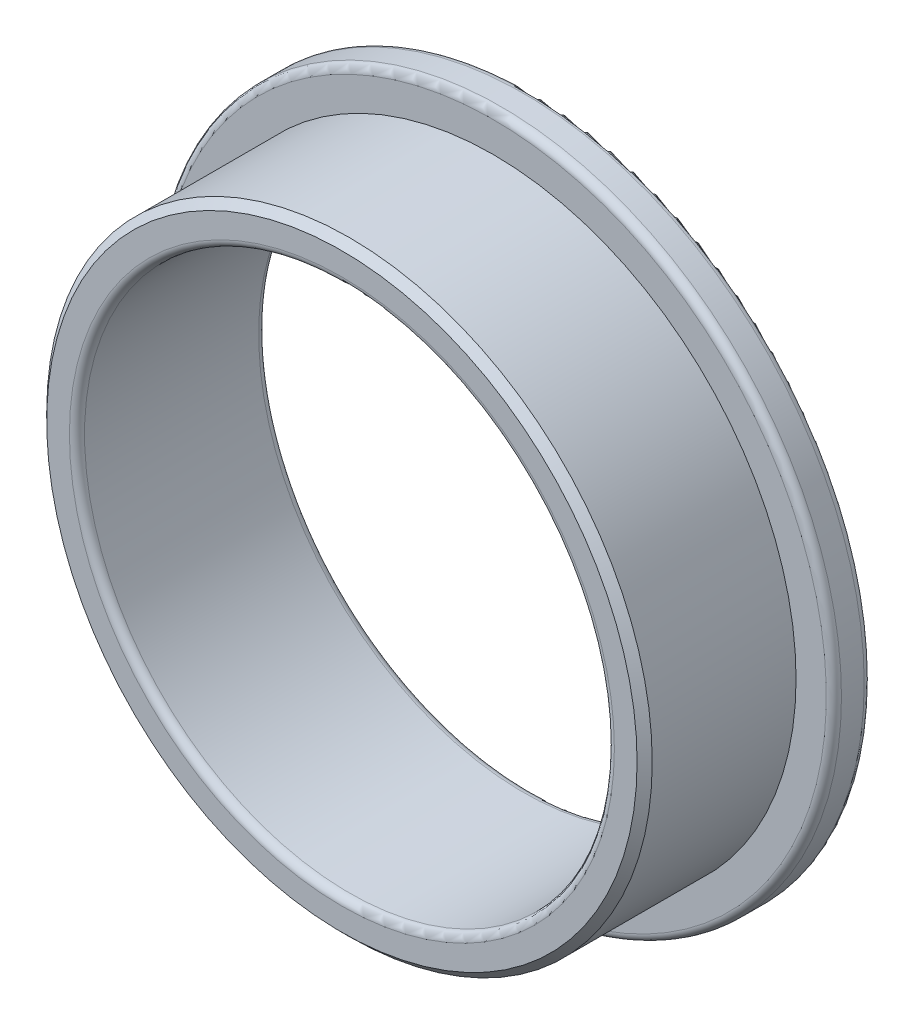
ISO-10303-21;
HEADER;
FILE_DESCRIPTION(('STEP AP214'),'2;1');
FILE_NAME('part.step','',(''),(''),'','','');
FILE_SCHEMA(('AUTOMOTIVE_DESIGN { 1 0 10303 214 1 1 1 1 }'));
ENDSEC;
DATA;
#1=APPLICATION_CONTEXT('core data for automotive mechanical design processes');
#2=APPLICATION_PROTOCOL_DEFINITION('international standard','automotive_design',2000,#1);
#3=PRODUCT_CONTEXT('',#1,'mechanical');
#4=PRODUCT('Part','Part','',(#3));
#5=PRODUCT_RELATED_PRODUCT_CATEGORY('part','',(#4));
#6=PRODUCT_DEFINITION_FORMATION('','',#4);
#7=PRODUCT_DEFINITION_CONTEXT('part definition',#1,'design');
#8=PRODUCT_DEFINITION('design','',#6,#7);
#9=PRODUCT_DEFINITION_SHAPE('','',#8);
#10=(LENGTH_UNIT() NAMED_UNIT(*) SI_UNIT(.MILLI.,.METRE.));
#11=(NAMED_UNIT(*) PLANE_ANGLE_UNIT() SI_UNIT($,.RADIAN.));
#12=(NAMED_UNIT(*) SI_UNIT($,.STERADIAN.) SOLID_ANGLE_UNIT());
#13=UNCERTAINTY_MEASURE_WITH_UNIT(LENGTH_MEASURE(1.E-05),#10,'distance_accuracy_value','');
#14=(GEOMETRIC_REPRESENTATION_CONTEXT(3) GLOBAL_UNCERTAINTY_ASSIGNED_CONTEXT((#13)) GLOBAL_UNIT_ASSIGNED_CONTEXT((#10,
#11,#12)) REPRESENTATION_CONTEXT('',''));
#15=CARTESIAN_POINT('',(0.,0.,0.));
#16=DIRECTION('',(0.,0.,1.));
#17=DIRECTION('',(1.,0.,0.));
#18=AXIS2_PLACEMENT_3D('',#15,#16,#17);
#19=CARTESIAN_POINT('',(0.,0.,5.));
#20=DIRECTION('',(0.,0.,-1.));
#21=DIRECTION('',(-1.,0.,0.));
#22=AXIS2_PLACEMENT_3D('',#19,#20,#21);
#23=CYLINDRICAL_SURFACE('',#22,8.);
#24=CARTESIAN_POINT('',(0.,0.,4.8));
#25=DIRECTION('',(0.,0.,1.));
#26=DIRECTION('',(1.,0.,0.));
#27=AXIS2_PLACEMENT_3D('',#24,#25,#26);
#28=CIRCLE('',#27,8.);
#29=CARTESIAN_POINT('',(8.,0.,4.8));
#30=VERTEX_POINT('',#29);
#31=EDGE_CURVE('E10',#30,#30,#28,.F.);
#32=ORIENTED_EDGE('',*,*,#31,.T.);
#33=EDGE_LOOP('',(#32));
#34=FACE_BOUND('',#33,.T.);
#35=CARTESIAN_POINT('',(0.,0.,1.));
#36=DIRECTION('',(0.,0.,-1.));
#37=DIRECTION('',(-1.,0.,0.));
#38=AXIS2_PLACEMENT_3D('',#35,#36,#37);
#39=CIRCLE('',#38,8.);
#40=CARTESIAN_POINT('',(-8.,0.,1.));
#41=VERTEX_POINT('',#40);
#42=EDGE_CURVE('E21',#41,#41,#39,.T.);
#43=ORIENTED_EDGE('',*,*,#42,.F.);
#44=EDGE_LOOP('',(#43));
#45=FACE_BOUND('',#44,.T.);
#46=ADVANCED_FACE('F15',(#34,#45),#23,.T.);
#47=CARTESIAN_POINT('',(0.,0.,5.));
#48=DIRECTION('',(0.,0.,1.));
#49=DIRECTION('',(1.,0.,0.));
#50=AXIS2_PLACEMENT_3D('',#47,#48,#49);
#51=PLANE('',#50);
#52=CARTESIAN_POINT('',(0.,0.,5.));
#53=DIRECTION('',(0.,0.,1.));
#54=DIRECTION('',(1.,0.,0.));
#55=AXIS2_PLACEMENT_3D('',#52,#53,#54);
#56=CIRCLE('',#55,7.8);
#57=CARTESIAN_POINT('',(7.8,0.,5.));
#58=VERTEX_POINT('',#57);
#59=EDGE_CURVE('E25',#58,#58,#56,.T.);
#60=ORIENTED_EDGE('',*,*,#59,.T.);
#61=EDGE_LOOP('',(#60));
#62=FACE_BOUND('',#61,.T.);
#63=CARTESIAN_POINT('',(0.,0.,5.));
#64=DIRECTION('',(0.,0.,1.));
#65=DIRECTION('',(1.,0.,0.));
#66=AXIS2_PLACEMENT_3D('',#63,#64,#65);
#67=CIRCLE('',#66,7.2);
#68=CARTESIAN_POINT('',(7.2,0.,5.));
#69=VERTEX_POINT('',#68);
#70=EDGE_CURVE('E29',#69,#69,#67,.F.);
#71=ORIENTED_EDGE('',*,*,#70,.T.);
#72=EDGE_LOOP('',(#71));
#73=FACE_BOUND('',#72,.T.);
#74=ADVANCED_FACE('F76',(#62,#73),#51,.T.);
#75=CARTESIAN_POINT('',(0.,0.,0.));
#76=DIRECTION('',(0.,0.,1.));
#77=DIRECTION('',(1.,0.,0.));
#78=AXIS2_PLACEMENT_3D('',#75,#76,#77);
#79=PLANE('',#78);
#80=CARTESIAN_POINT('',(0.,0.,0.));
#81=DIRECTION('',(0.,0.,1.));
#82=DIRECTION('',(1.,0.,0.));
#83=AXIS2_PLACEMENT_3D('',#80,#81,#82);
#84=CIRCLE('',#83,7.2);
#85=CARTESIAN_POINT('',(7.2,0.,0.));
#86=VERTEX_POINT('',#85);
#87=EDGE_CURVE('E34',#86,#86,#84,.T.);
#88=ORIENTED_EDGE('',*,*,#87,.T.);
#89=EDGE_LOOP('',(#88));
#90=FACE_BOUND('',#89,.T.);
#91=CARTESIAN_POINT('',(0.,0.,0.));
#92=DIRECTION('',(0.,0.,1.));
#93=DIRECTION('',(1.,0.,0.));
#94=AXIS2_PLACEMENT_3D('',#91,#92,#93);
#95=CIRCLE('',#94,8.8);
#96=CARTESIAN_POINT('',(8.8,0.,0.));
#97=VERTEX_POINT('',#96);
#98=EDGE_CURVE('E37',#97,#97,#95,.F.);
#99=ORIENTED_EDGE('',*,*,#98,.T.);
#100=EDGE_LOOP('',(#99));
#101=FACE_BOUND('',#100,.T.);
#102=ADVANCED_FACE('F80',(#90,#101),#79,.F.);
#103=CARTESIAN_POINT('',(0.,0.,5.));
#104=DIRECTION('',(0.,0.,-1.));
#105=DIRECTION('',(-1.,0.,0.));
#106=AXIS2_PLACEMENT_3D('',#103,#104,#105);
#107=CYLINDRICAL_SURFACE('',#106,7.);
#108=CARTESIAN_POINT('',(0.,0.,0.2));
#109=DIRECTION('',(0.,0.,1.));
#110=DIRECTION('',(1.,0.,0.));
#111=AXIS2_PLACEMENT_3D('',#108,#109,#110);
#112=CIRCLE('',#111,7.);
#113=CARTESIAN_POINT('',(7.,0.,0.2));
#114=VERTEX_POINT('',#113);
#115=EDGE_CURVE('E40',#114,#114,#112,.F.);
#116=ORIENTED_EDGE('',*,*,#115,.T.);
#117=EDGE_LOOP('',(#116));
#118=FACE_BOUND('',#117,.T.);
#119=CARTESIAN_POINT('',(0.,0.,4.8));
#120=DIRECTION('',(0.,0.,1.));
#121=DIRECTION('',(1.,0.,0.));
#122=AXIS2_PLACEMENT_3D('',#119,#120,#121);
#123=CIRCLE('',#122,7.);
#124=CARTESIAN_POINT('',(7.,0.,4.8));
#125=VERTEX_POINT('',#124);
#126=EDGE_CURVE('E43',#125,#125,#123,.T.);
#127=ORIENTED_EDGE('',*,*,#126,.T.);
#128=EDGE_LOOP('',(#127));
#129=FACE_BOUND('',#128,.T.);
#130=ADVANCED_FACE('F86',(#118,#129),#107,.F.);
#131=CARTESIAN_POINT('',(0.,0.,1.));
#132=DIRECTION('',(0.,0.,-1.));
#133=DIRECTION('',(-1.,0.,0.));
#134=AXIS2_PLACEMENT_3D('',#131,#132,#133);
#135=PLANE('',#134);
#136=CARTESIAN_POINT('',(0.,0.,1.));
#137=DIRECTION('',(0.,0.,-1.));
#138=DIRECTION('',(-1.,0.,0.));
#139=AXIS2_PLACEMENT_3D('',#136,#137,#138);
#140=CIRCLE('',#139,8.8);
#141=CARTESIAN_POINT('',(-8.8,0.,1.));
#142=VERTEX_POINT('',#141);
#143=EDGE_CURVE('E46',#142,#142,#140,.F.);
#144=ORIENTED_EDGE('',*,*,#143,.T.);
#145=EDGE_LOOP('',(#144));
#146=FACE_BOUND('',#145,.T.);
#147=ORIENTED_EDGE('',*,*,#42,.T.);
#148=EDGE_LOOP('',(#147));
#149=FACE_BOUND('',#148,.T.);
#150=ADVANCED_FACE('F93',(#146,#149),#135,.F.);
#151=CARTESIAN_POINT('',(0.,0.,1.));
#152=DIRECTION('',(0.,0.,-1.));
#153=DIRECTION('',(-1.,0.,0.));
#154=AXIS2_PLACEMENT_3D('',#151,#152,#153);
#155=CYLINDRICAL_SURFACE('',#154,9.);
#156=CARTESIAN_POINT('',(0.,0.,0.2));
#157=DIRECTION('',(0.,0.,1.));
#158=DIRECTION('',(1.,0.,0.));
#159=AXIS2_PLACEMENT_3D('',#156,#157,#158);
#160=CIRCLE('',#159,9.);
#161=CARTESIAN_POINT('',(9.,0.,0.2));
#162=VERTEX_POINT('',#161);
#163=EDGE_CURVE('E49',#162,#162,#160,.T.);
#164=ORIENTED_EDGE('',*,*,#163,.T.);
#165=EDGE_LOOP('',(#164));
#166=FACE_BOUND('',#165,.T.);
#167=CARTESIAN_POINT('',(0.,0.,0.8));
#168=DIRECTION('',(0.,0.,-1.));
#169=DIRECTION('',(-1.,0.,0.));
#170=AXIS2_PLACEMENT_3D('',#167,#168,#169);
#171=CIRCLE('',#170,9.);
#172=CARTESIAN_POINT('',(-9.,0.,0.8));
#173=VERTEX_POINT('',#172);
#174=EDGE_CURVE('E52',#173,#173,#171,.T.);
#175=ORIENTED_EDGE('',*,*,#174,.T.);
#176=EDGE_LOOP('',(#175));
#177=FACE_BOUND('',#176,.T.);
#178=ADVANCED_FACE('F56',(#166,#177),#155,.T.);
#179=CARTESIAN_POINT('',(0.,0.,0.2));
#180=DIRECTION('',(0.,0.,1.));
#181=DIRECTION('',(1.,0.,0.));
#182=AXIS2_PLACEMENT_3D('',#179,#180,#181);
#183=TOROIDAL_SURFACE('',#182,7.2,0.2);
#184=ORIENTED_EDGE('',*,*,#115,.F.);
#185=EDGE_LOOP('',(#184));
#186=FACE_BOUND('',#185,.T.);
#187=ORIENTED_EDGE('',*,*,#87,.F.);
#188=EDGE_LOOP('',(#187));
#189=FACE_BOUND('',#188,.T.);
#190=ADVANCED_FACE('F100',(#186,#189),#183,.T.);
#191=CARTESIAN_POINT('',(0.,0.,4.8));
#192=DIRECTION('',(0.,0.,1.));
#193=DIRECTION('',(1.,0.,0.));
#194=AXIS2_PLACEMENT_3D('',#191,#192,#193);
#195=TOROIDAL_SURFACE('',#194,7.2,0.2);
#196=ORIENTED_EDGE('',*,*,#70,.F.);
#197=EDGE_LOOP('',(#196));
#198=FACE_BOUND('',#197,.T.);
#199=ORIENTED_EDGE('',*,*,#126,.F.);
#200=EDGE_LOOP('',(#199));
#201=FACE_BOUND('',#200,.T.);
#202=ADVANCED_FACE('F71',(#198,#201),#195,.T.);
#203=CARTESIAN_POINT('',(0.,0.,0.2));
#204=DIRECTION('',(0.,0.,1.));
#205=DIRECTION('',(1.,0.,0.));
#206=AXIS2_PLACEMENT_3D('',#203,#204,#205);
#207=TOROIDAL_SURFACE('',#206,8.8,0.2);
#208=ORIENTED_EDGE('',*,*,#163,.F.);
#209=EDGE_LOOP('',(#208));
#210=FACE_BOUND('',#209,.T.);
#211=ORIENTED_EDGE('',*,*,#98,.F.);
#212=EDGE_LOOP('',(#211));
#213=FACE_BOUND('',#212,.T.);
#214=ADVANCED_FACE('F61',(#210,#213),#207,.T.);
#215=CARTESIAN_POINT('',(0.,0.,0.8));
#216=DIRECTION('',(0.,0.,-1.));
#217=DIRECTION('',(-1.,0.,0.));
#218=AXIS2_PLACEMENT_3D('',#215,#216,#217);
#219=TOROIDAL_SURFACE('',#218,8.8,0.2);
#220=ORIENTED_EDGE('',*,*,#143,.F.);
#221=EDGE_LOOP('',(#220));
#222=FACE_BOUND('',#221,.T.);
#223=ORIENTED_EDGE('',*,*,#174,.F.);
#224=EDGE_LOOP('',(#223));
#225=FACE_BOUND('',#224,.T.);
#226=ADVANCED_FACE('F58',(#222,#225),#219,.T.);
#227=CARTESIAN_POINT('',(0.,0.,5.));
#228=DIRECTION('',(0.,0.,-1.));
#229=DIRECTION('',(-1.,0.,0.));
#230=AXIS2_PLACEMENT_3D('',#227,#228,#229);
#231=CONICAL_SURFACE('',#230,7.8,0.785398163397448);
#232=ORIENTED_EDGE('',*,*,#31,.F.);
#233=EDGE_LOOP('',(#232));
#234=FACE_BOUND('',#233,.T.);
#235=ORIENTED_EDGE('',*,*,#59,.F.);
#236=EDGE_LOOP('',(#235));
#237=FACE_BOUND('',#236,.T.);
#238=ADVANCED_FACE('F60',(#234,#237),#231,.T.);
#239=CLOSED_SHELL('',(#46,#74,#102,#130,#150,#178,#190,#202,#214,#226,#238));
#240=MANIFOLD_SOLID_BREP('B1',#239);
#241=ADVANCED_BREP_SHAPE_REPRESENTATION('',(#18,#240),#14);
#242=SHAPE_DEFINITION_REPRESENTATION(#9,#241);
ENDSEC;
END-ISO-10303-21;
